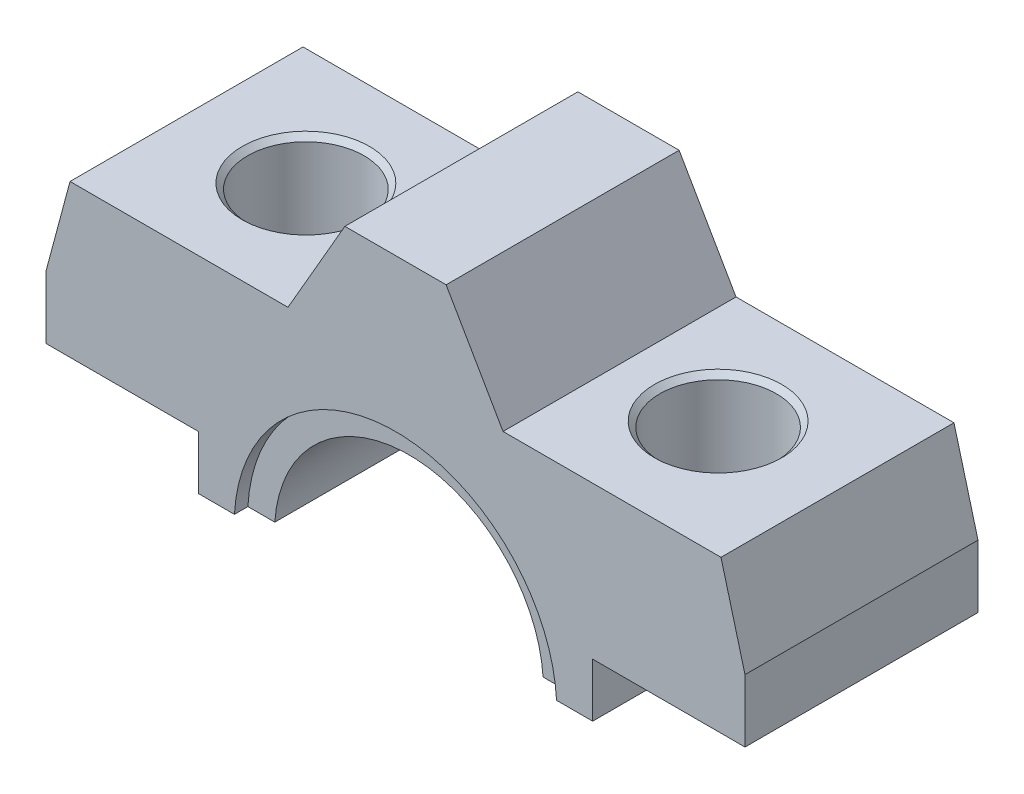
ISO-10303-21;
HEADER;
FILE_DESCRIPTION(('STEP AP214'),'2;1');
FILE_NAME('part.step','',(''),(''),'','','');
FILE_SCHEMA(('AUTOMOTIVE_DESIGN { 1 0 10303 214 1 1 1 1 }'));
ENDSEC;
DATA;
#1=APPLICATION_CONTEXT('core data for automotive mechanical design processes');
#2=APPLICATION_PROTOCOL_DEFINITION('international standard','automotive_design',2000,#1);
#3=PRODUCT_CONTEXT('',#1,'mechanical');
#4=PRODUCT('Part','Part','',(#3));
#5=PRODUCT_RELATED_PRODUCT_CATEGORY('part','',(#4));
#6=PRODUCT_DEFINITION_FORMATION('','',#4);
#7=PRODUCT_DEFINITION_CONTEXT('part definition',#1,'design');
#8=PRODUCT_DEFINITION('design','',#6,#7);
#9=PRODUCT_DEFINITION_SHAPE('','',#8);
#10=(LENGTH_UNIT() NAMED_UNIT(*) SI_UNIT(.MILLI.,.METRE.));
#11=(NAMED_UNIT(*) PLANE_ANGLE_UNIT() SI_UNIT($,.RADIAN.));
#12=(NAMED_UNIT(*) SI_UNIT($,.STERADIAN.) SOLID_ANGLE_UNIT());
#13=UNCERTAINTY_MEASURE_WITH_UNIT(LENGTH_MEASURE(1.E-05),#10,'distance_accuracy_value','');
#14=(GEOMETRIC_REPRESENTATION_CONTEXT(3) GLOBAL_UNCERTAINTY_ASSIGNED_CONTEXT((#13)) GLOBAL_UNIT_ASSIGNED_CONTEXT((#10,
#11,#12)) REPRESENTATION_CONTEXT('',''));
#15=CARTESIAN_POINT('',(0.,0.,0.));
#16=DIRECTION('',(0.,0.,1.));
#17=DIRECTION('',(1.,0.,0.));
#18=AXIS2_PLACEMENT_3D('',#15,#16,#17);
#19=CARTESIAN_POINT('',(22.,1.,-26.));
#20=DIRECTION('',(1.,0.,0.));
#21=DIRECTION('',(0.,0.,-1.));
#22=AXIS2_PLACEMENT_3D('',#19,#20,#21);
#23=PLANE('',#22);
#24=DIRECTION('',(0.,1.,0.));
#25=VECTOR('',#24,1.);
#26=CARTESIAN_POINT('',(22.,1.,-19.4226162893326));
#27=LINE('',#26,#25);
#28=CARTESIAN_POINT('',(22.,1.,-19.4226162893326));
#29=VERTEX_POINT('',#28);
#30=CARTESIAN_POINT('',(22.,7.,-19.4226162893326));
#31=VERTEX_POINT('',#30);
#32=EDGE_CURVE('E200',#29,#31,#27,.T.);
#33=ORIENTED_EDGE('',*,*,#32,.F.);
#34=DIRECTION('',(0.,0.,1.));
#35=VECTOR('',#34,1.);
#36=CARTESIAN_POINT('',(22.,1.,-26.));
#37=LINE('',#36,#35);
#38=CARTESIAN_POINT('',(22.,1.,-26.));
#39=VERTEX_POINT('',#38);
#40=EDGE_CURVE('E210',#39,#29,#37,.T.);
#41=ORIENTED_EDGE('',*,*,#40,.F.);
#42=DIRECTION('',(0.,1.,0.));
#43=VECTOR('',#42,1.);
#44=CARTESIAN_POINT('',(22.,1.,-26.));
#45=LINE('',#44,#43);
#46=CARTESIAN_POINT('',(22.,7.,-26.));
#47=VERTEX_POINT('',#46);
#48=EDGE_CURVE('E421',#39,#47,#45,.T.);
#49=ORIENTED_EDGE('',*,*,#48,.T.);
#50=DIRECTION('',(0.,0.,1.));
#51=VECTOR('',#50,1.);
#52=CARTESIAN_POINT('',(22.,7.,-26.));
#53=LINE('',#52,#51);
#54=EDGE_CURVE('E212',#47,#31,#53,.T.);
#55=ORIENTED_EDGE('',*,*,#54,.T.);
#56=EDGE_LOOP('',(#33,#41,#49,#55));
#57=FACE_BOUND('',#56,.T.);
#58=ADVANCED_FACE('F38',(#57),#23,.T.);
#59=CARTESIAN_POINT('',(-22.,7.,-26.));
#60=DIRECTION('',(-1.,0.,0.));
#61=DIRECTION('',(0.,0.,1.));
#62=AXIS2_PLACEMENT_3D('',#59,#60,#61);
#63=PLANE('',#62);
#64=DIRECTION('',(0.,1.,0.));
#65=VECTOR('',#64,1.);
#66=CARTESIAN_POINT('',(-22.,1.,-6.57738371066743));
#67=LINE('',#66,#65);
#68=CARTESIAN_POINT('',(-22.,1.,-6.57738371066743));
#69=VERTEX_POINT('',#68);
#70=CARTESIAN_POINT('',(-22.,7.,-6.57738371066743));
#71=VERTEX_POINT('',#70);
#72=EDGE_CURVE('E61',#69,#71,#67,.T.);
#73=ORIENTED_EDGE('',*,*,#72,.F.);
#74=DIRECTION('',(0.,0.,1.));
#75=VECTOR('',#74,1.);
#76=CARTESIAN_POINT('',(-22.,1.,-26.));
#77=LINE('',#76,#75);
#78=CARTESIAN_POINT('',(-22.,1.,0.));
#79=VERTEX_POINT('',#78);
#80=EDGE_CURVE('E228',#69,#79,#77,.T.);
#81=ORIENTED_EDGE('',*,*,#80,.T.);
#82=DIRECTION('',(0.,-1.,0.));
#83=VECTOR('',#82,1.);
#84=CARTESIAN_POINT('',(-22.,7.,0.));
#85=LINE('',#84,#83);
#86=CARTESIAN_POINT('',(-22.,7.,0.));
#87=VERTEX_POINT('',#86);
#88=EDGE_CURVE('E436',#87,#79,#85,.T.);
#89=ORIENTED_EDGE('',*,*,#88,.F.);
#90=DIRECTION('',(0.,0.,1.));
#91=VECTOR('',#90,1.);
#92=CARTESIAN_POINT('',(-22.,7.,-26.));
#93=LINE('',#92,#91);
#94=EDGE_CURVE('E232',#71,#87,#93,.T.);
#95=ORIENTED_EDGE('',*,*,#94,.F.);
#96=EDGE_LOOP('',(#73,#81,#89,#95));
#97=FACE_BOUND('',#96,.T.);
#98=ADVANCED_FACE('F265',(#97),#63,.T.);
#99=CARTESIAN_POINT('',(0.,0.,-26.));
#100=DIRECTION('',(0.,0.,1.));
#101=DIRECTION('',(1.,0.,0.));
#102=AXIS2_PLACEMENT_3D('',#99,#100,#101);
#103=CYLINDRICAL_SURFACE('',#102,15.);
#104=CARTESIAN_POINT('',(0.,0.,-24.5));
#105=DIRECTION('',(0.,0.,-1.));
#106=DIRECTION('',(-1.,0.,0.));
#107=AXIS2_PLACEMENT_3D('',#104,#105,#106);
#108=CIRCLE('',#107,15.);
#109=CARTESIAN_POINT('',(14.9666295470958,1.,-24.5));
#110=VERTEX_POINT('',#109);
#111=CARTESIAN_POINT('',(-14.9666295470958,1.,-24.5));
#112=VERTEX_POINT('',#111);
#113=EDGE_CURVE('E387',#110,#112,#108,.F.);
#114=ORIENTED_EDGE('',*,*,#113,.F.);
#115=DIRECTION('',(0.,0.,1.));
#116=VECTOR('',#115,1.);
#117=CARTESIAN_POINT('',(14.9666295470958,1.,-26.));
#118=LINE('',#117,#116);
#119=CARTESIAN_POINT('',(14.9666295470958,1.,-1.5));
#120=VERTEX_POINT('',#119);
#121=EDGE_CURVE('E410',#110,#120,#118,.T.);
#122=ORIENTED_EDGE('',*,*,#121,.T.);
#123=CARTESIAN_POINT('',(0.,0.,-1.5));
#124=DIRECTION('',(0.,0.,1.));
#125=DIRECTION('',(1.,0.,0.));
#126=AXIS2_PLACEMENT_3D('',#123,#124,#125);
#127=CIRCLE('',#126,15.);
#128=CARTESIAN_POINT('',(-14.9666295470958,1.,-1.50000000000001));
#129=VERTEX_POINT('',#128);
#130=EDGE_CURVE('E237',#129,#120,#127,.F.);
#131=ORIENTED_EDGE('',*,*,#130,.F.);
#132=DIRECTION('',(0.,0.,1.));
#133=VECTOR('',#132,1.);
#134=CARTESIAN_POINT('',(-14.9666295470958,1.,-26.));
#135=LINE('',#134,#133);
#136=EDGE_CURVE('E407',#129,#112,#135,.F.);
#137=ORIENTED_EDGE('',*,*,#136,.T.);
#138=EDGE_LOOP('',(#114,#122,#131,#137));
#139=FACE_BOUND('',#138,.T.);
#140=ADVANCED_FACE('F271',(#139),#103,.F.);
#141=CARTESIAN_POINT('',(-22.,1.,-26.));
#142=DIRECTION('',(0.,-1.,0.));
#143=DIRECTION('',(0.,0.,-1.));
#144=AXIS2_PLACEMENT_3D('',#141,#142,#143);
#145=PLANE('',#144);
#146=CARTESIAN_POINT('',(23.,1.,-13.));
#147=DIRECTION('',(0.,1.,0.));
#148=DIRECTION('',(0.,0.,1.));
#149=AXIS2_PLACEMENT_3D('',#146,#147,#148);
#150=CIRCLE('',#149,6.5);
#151=CARTESIAN_POINT('',(22.,1.,-6.57738371066743));
#152=VERTEX_POINT('',#151);
#153=EDGE_CURVE('E197',#29,#152,#150,.T.);
#154=ORIENTED_EDGE('',*,*,#153,.T.);
#155=CARTESIAN_POINT('',(22.,1.,0.));
#156=VERTEX_POINT('',#155);
#157=EDGE_CURVE('E220',#152,#156,#37,.T.);
#158=ORIENTED_EDGE('',*,*,#157,.T.);
#159=DIRECTION('',(1.,0.,0.));
#160=VECTOR('',#159,1.);
#161=CARTESIAN_POINT('',(-22.,1.,0.));
#162=LINE('',#161,#160);
#163=CARTESIAN_POINT('',(17.9722007556114,1.,0.));
#164=VERTEX_POINT('',#163);
#165=EDGE_CURVE('E307',#164,#156,#162,.T.);
#166=ORIENTED_EDGE('',*,*,#165,.F.);
#167=DIRECTION('',(0.,0.,1.));
#168=VECTOR('',#167,1.);
#169=CARTESIAN_POINT('',(17.9722007556114,1.,-1.5));
#170=LINE('',#169,#168);
#171=CARTESIAN_POINT('',(17.9722007556114,1.,-1.5));
#172=VERTEX_POINT('',#171);
#173=EDGE_CURVE('E405',#172,#164,#170,.T.);
#174=ORIENTED_EDGE('',*,*,#173,.F.);
#175=DIRECTION('',(-1.,0.,0.));
#176=VECTOR('',#175,1.);
#177=CARTESIAN_POINT('',(-22.,1.,-1.5));
#178=LINE('',#177,#176);
#179=EDGE_CURVE('E400',#172,#120,#178,.T.);
#180=ORIENTED_EDGE('',*,*,#179,.T.);
#181=ORIENTED_EDGE('',*,*,#121,.F.);
#182=DIRECTION('',(1.,0.,0.));
#183=VECTOR('',#182,1.);
#184=CARTESIAN_POINT('',(-22.,1.,-24.5));
#185=LINE('',#184,#183);
#186=CARTESIAN_POINT('',(17.9722007556114,1.,-24.5));
#187=VERTEX_POINT('',#186);
#188=EDGE_CURVE('E389',#110,#187,#185,.T.);
#189=ORIENTED_EDGE('',*,*,#188,.T.);
#190=DIRECTION('',(0.,0.,-1.));
#191=VECTOR('',#190,1.);
#192=CARTESIAN_POINT('',(17.9722007556114,1.,-24.5));
#193=LINE('',#192,#191);
#194=CARTESIAN_POINT('',(17.9722007556114,1.,-26.));
#195=VERTEX_POINT('',#194);
#196=EDGE_CURVE('E385',#195,#187,#193,.F.);
#197=ORIENTED_EDGE('',*,*,#196,.F.);
#198=DIRECTION('',(1.,0.,0.));
#199=VECTOR('',#198,1.);
#200=CARTESIAN_POINT('',(-22.,1.,-26.));
#201=LINE('',#200,#199);
#202=EDGE_CURVE('E218',#195,#39,#201,.T.);
#203=ORIENTED_EDGE('',*,*,#202,.T.);
#204=ORIENTED_EDGE('',*,*,#40,.T.);
#205=EDGE_LOOP('',(#154,#158,#166,#174,#180,#181,#189,#197,#203,#204));
#206=FACE_BOUND('',#205,.T.);
#207=ADVANCED_FACE('F215',(#206),#145,.T.);
#208=CARTESIAN_POINT('',(-35.0998575495685,24.,-26.));
#209=DIRECTION('',(0.,1.,0.));
#210=DIRECTION('',(0.,0.,1.));
#211=AXIS2_PLACEMENT_3D('',#208,#209,#210);
#212=PLANE('',#211);
#213=CARTESIAN_POINT('',(-23.,24.,-13.));
#214=DIRECTION('',(0.,1.,0.));
#215=DIRECTION('',(0.,0.,1.));
#216=AXIS2_PLACEMENT_3D('',#213,#214,#215);
#217=CIRCLE('',#216,7.09999999999998);
#218=CARTESIAN_POINT('',(-23.,24.,-5.90000000000002));
#219=VERTEX_POINT('',#218);
#220=EDGE_CURVE('E11',#219,#219,#217,.F.);
#221=ORIENTED_EDGE('',*,*,#220,.T.);
#222=EDGE_LOOP('',(#221));
#223=FACE_BOUND('',#222,.T.);
#224=DIRECTION('',(-1.,0.,0.));
#225=VECTOR('',#224,1.);
#226=CARTESIAN_POINT('',(-35.0998575495685,24.,-26.));
#227=LINE('',#226,#225);
#228=CARTESIAN_POINT('',(-12.,24.,-26.));
#229=VERTEX_POINT('',#228);
#230=CARTESIAN_POINT('',(-36.3205080756888,24.,-26.));
#231=VERTEX_POINT('',#230);
#232=EDGE_CURVE('E236',#229,#231,#227,.T.);
#233=ORIENTED_EDGE('',*,*,#232,.T.);
#234=DIRECTION('',(0.,0.,1.));
#235=VECTOR('',#234,1.);
#236=CARTESIAN_POINT('',(-36.3205080756888,24.,-50.0416305603426));
#237=LINE('',#236,#235);
#238=CARTESIAN_POINT('',(-36.3205080756888,24.,0.));
#239=VERTEX_POINT('',#238);
#240=EDGE_CURVE('E367',#231,#239,#237,.T.);
#241=ORIENTED_EDGE('',*,*,#240,.T.);
#242=DIRECTION('',(-1.,0.,0.));
#243=VECTOR('',#242,1.);
#244=CARTESIAN_POINT('',(-35.0998575495685,24.,0.));
#245=LINE('',#244,#243);
#246=CARTESIAN_POINT('',(-12.,24.,0.));
#247=VERTEX_POINT('',#246);
#248=EDGE_CURVE('E324',#247,#239,#245,.T.);
#249=ORIENTED_EDGE('',*,*,#248,.F.);
#250=DIRECTION('',(0.,0.,1.));
#251=VECTOR('',#250,1.);
#252=CARTESIAN_POINT('',(-12.,24.,-26.));
#253=LINE('',#252,#251);
#254=EDGE_CURVE('E241',#229,#247,#253,.T.);
#255=ORIENTED_EDGE('',*,*,#254,.F.);
#256=EDGE_LOOP('',(#233,#241,#249,#255));
#257=FACE_BOUND('',#256,.T.);
#258=ADVANCED_FACE('F498',(#223,#257),#212,.T.);
#259=CARTESIAN_POINT('',(-12.,24.,-26.));
#260=DIRECTION('',(-0.866025403784442,0.499999999999995,0.));
#261=DIRECTION('',(-0.499999999999995,-0.866025403784442,0.));
#262=AXIS2_PLACEMENT_3D('',#259,#260,#261);
#263=PLANE('',#262);
#264=DIRECTION('',(-0.499999999999995,-0.866025403784442,0.));
#265=VECTOR('',#264,1.);
#266=CARTESIAN_POINT('',(-12.,24.,0.));
#267=LINE('',#266,#265);
#268=CARTESIAN_POINT('',(-5.6491470389142,35.,0.));
#269=VERTEX_POINT('',#268);
#270=EDGE_CURVE('E321',#269,#247,#267,.T.);
#271=ORIENTED_EDGE('',*,*,#270,.F.);
#272=DIRECTION('',(0.,0.,1.));
#273=VECTOR('',#272,1.);
#274=CARTESIAN_POINT('',(-5.6491470389142,35.,-26.));
#275=LINE('',#274,#273);
#276=CARTESIAN_POINT('',(-5.6491470389142,35.,-26.));
#277=VERTEX_POINT('',#276);
#278=EDGE_CURVE('E328',#277,#269,#275,.T.);
#279=ORIENTED_EDGE('',*,*,#278,.F.);
#280=DIRECTION('',(-0.499999999999995,-0.866025403784442,0.));
#281=VECTOR('',#280,1.);
#282=CARTESIAN_POINT('',(-12.,24.,-26.));
#283=LINE('',#282,#281);
#284=EDGE_CURVE('E431',#277,#229,#283,.T.);
#285=ORIENTED_EDGE('',*,*,#284,.T.);
#286=ORIENTED_EDGE('',*,*,#254,.T.);
#287=EDGE_LOOP('',(#271,#279,#285,#286));
#288=FACE_BOUND('',#287,.T.);
#289=ADVANCED_FACE('F501',(#288),#263,.T.);
#290=CARTESIAN_POINT('',(-5.6491470389142,35.,-26.));
#291=DIRECTION('',(0.,1.,0.));
#292=DIRECTION('',(0.,0.,1.));
#293=AXIS2_PLACEMENT_3D('',#290,#291,#292);
#294=PLANE('',#293);
#295=DIRECTION('',(-1.,0.,0.));
#296=VECTOR('',#295,1.);
#297=CARTESIAN_POINT('',(-5.6491470389142,35.,0.));
#298=LINE('',#297,#296);
#299=CARTESIAN_POINT('',(5.6491470389142,35.,0.));
#300=VERTEX_POINT('',#299);
#301=EDGE_CURVE('E318',#300,#269,#298,.T.);
#302=ORIENTED_EDGE('',*,*,#301,.F.);
#303=DIRECTION('',(0.,0.,1.));
#304=VECTOR('',#303,1.);
#305=CARTESIAN_POINT('',(5.6491470389142,35.,-26.));
#306=LINE('',#305,#304);
#307=CARTESIAN_POINT('',(5.6491470389142,35.,-26.));
#308=VERTEX_POINT('',#307);
#309=EDGE_CURVE('E330',#308,#300,#306,.T.);
#310=ORIENTED_EDGE('',*,*,#309,.F.);
#311=DIRECTION('',(-1.,0.,0.));
#312=VECTOR('',#311,1.);
#313=CARTESIAN_POINT('',(-5.6491470389142,35.,-26.));
#314=LINE('',#313,#312);
#315=EDGE_CURVE('E428',#308,#277,#314,.T.);
#316=ORIENTED_EDGE('',*,*,#315,.T.);
#317=ORIENTED_EDGE('',*,*,#278,.T.);
#318=EDGE_LOOP('',(#302,#310,#316,#317));
#319=FACE_BOUND('',#318,.T.);
#320=ADVANCED_FACE('F503',(#319),#294,.T.);
#321=CARTESIAN_POINT('',(5.6491470389142,35.,-26.));
#322=DIRECTION('',(0.866025403784442,0.499999999999995,0.));
#323=DIRECTION('',(-0.499999999999995,0.866025403784442,0.));
#324=AXIS2_PLACEMENT_3D('',#321,#322,#323);
#325=PLANE('',#324);
#326=DIRECTION('',(-0.499999999999995,0.866025403784442,0.));
#327=VECTOR('',#326,1.);
#328=CARTESIAN_POINT('',(5.6491470389142,35.,0.));
#329=LINE('',#328,#327);
#330=CARTESIAN_POINT('',(12.,24.,0.));
#331=VERTEX_POINT('',#330);
#332=EDGE_CURVE('E315',#331,#300,#329,.T.);
#333=ORIENTED_EDGE('',*,*,#332,.F.);
#334=DIRECTION('',(0.,0.,1.));
#335=VECTOR('',#334,1.);
#336=CARTESIAN_POINT('',(12.,24.,-26.));
#337=LINE('',#336,#335);
#338=CARTESIAN_POINT('',(12.,24.,-26.));
#339=VERTEX_POINT('',#338);
#340=EDGE_CURVE('E332',#339,#331,#337,.T.);
#341=ORIENTED_EDGE('',*,*,#340,.F.);
#342=DIRECTION('',(-0.499999999999995,0.866025403784442,0.));
#343=VECTOR('',#342,1.);
#344=CARTESIAN_POINT('',(5.6491470389142,35.,-26.));
#345=LINE('',#344,#343);
#346=EDGE_CURVE('E426',#339,#308,#345,.T.);
#347=ORIENTED_EDGE('',*,*,#346,.T.);
#348=ORIENTED_EDGE('',*,*,#309,.T.);
#349=EDGE_LOOP('',(#333,#341,#347,#348));
#350=FACE_BOUND('',#349,.T.);
#351=ADVANCED_FACE('F343',(#350),#325,.T.);
#352=CARTESIAN_POINT('',(12.,24.,-26.));
#353=DIRECTION('',(0.,1.,0.));
#354=DIRECTION('',(0.,0.,1.));
#355=AXIS2_PLACEMENT_3D('',#352,#353,#354);
#356=PLANE('',#355);
#357=CARTESIAN_POINT('',(23.,24.,-13.));
#358=DIRECTION('',(0.,1.,0.));
#359=DIRECTION('',(0.,0.,1.));
#360=AXIS2_PLACEMENT_3D('',#357,#358,#359);
#361=CIRCLE('',#360,7.09999999999998);
#362=CARTESIAN_POINT('',(23.,24.,-5.90000000000002));
#363=VERTEX_POINT('',#362);
#364=EDGE_CURVE('E249',#363,#363,#361,.F.);
#365=ORIENTED_EDGE('',*,*,#364,.T.);
#366=EDGE_LOOP('',(#365));
#367=FACE_BOUND('',#366,.T.);
#368=ORIENTED_EDGE('',*,*,#340,.T.);
#369=DIRECTION('',(-1.,0.,0.));
#370=VECTOR('',#369,1.);
#371=CARTESIAN_POINT('',(12.,24.,0.));
#372=LINE('',#371,#370);
#373=CARTESIAN_POINT('',(36.3205080756888,24.,0.));
#374=VERTEX_POINT('',#373);
#375=EDGE_CURVE('E300',#374,#331,#372,.T.);
#376=ORIENTED_EDGE('',*,*,#375,.F.);
#377=DIRECTION('',(0.,0.,1.));
#378=VECTOR('',#377,1.);
#379=CARTESIAN_POINT('',(36.3205080756888,24.,-50.0416305603426));
#380=LINE('',#379,#378);
#381=CARTESIAN_POINT('',(36.3205080756888,24.,-26.));
#382=VERTEX_POINT('',#381);
#383=EDGE_CURVE('E353',#382,#374,#380,.T.);
#384=ORIENTED_EDGE('',*,*,#383,.F.);
#385=DIRECTION('',(-1.,0.,0.));
#386=VECTOR('',#385,1.);
#387=CARTESIAN_POINT('',(12.,24.,-26.));
#388=LINE('',#387,#386);
#389=EDGE_CURVE('E339',#382,#339,#388,.T.);
#390=ORIENTED_EDGE('',*,*,#389,.T.);
#391=EDGE_LOOP('',(#368,#376,#384,#390));
#392=FACE_BOUND('',#391,.T.);
#393=ADVANCED_FACE('F286',(#367,#392),#356,.T.);
#394=CARTESIAN_POINT('',(22.,7.,-26.));
#395=DIRECTION('',(0.,-1.,0.));
#396=DIRECTION('',(0.,0.,-1.));
#397=AXIS2_PLACEMENT_3D('',#394,#395,#396);
#398=PLANE('',#397);
#399=CARTESIAN_POINT('',(23.,7.,-13.));
#400=DIRECTION('',(0.,-1.,0.));
#401=DIRECTION('',(0.,0.,-1.));
#402=AXIS2_PLACEMENT_3D('',#399,#400,#401);
#403=CIRCLE('',#402,6.5);
#404=CARTESIAN_POINT('',(22.,7.,-6.57738371066744));
#405=VERTEX_POINT('',#404);
#406=EDGE_CURVE('E53',#31,#405,#403,.T.);
#407=ORIENTED_EDGE('',*,*,#406,.F.);
#408=ORIENTED_EDGE('',*,*,#54,.F.);
#409=DIRECTION('',(1.,0.,0.));
#410=VECTOR('',#409,1.);
#411=CARTESIAN_POINT('',(22.,7.,-26.));
#412=LINE('',#411,#410);
#413=CARTESIAN_POINT('',(39.,7.,-26.));
#414=VERTEX_POINT('',#413);
#415=EDGE_CURVE('E423',#47,#414,#412,.T.);
#416=ORIENTED_EDGE('',*,*,#415,.T.);
#417=DIRECTION('',(0.,0.,1.));
#418=VECTOR('',#417,1.);
#419=CARTESIAN_POINT('',(39.,7.,-26.));
#420=LINE('',#419,#418);
#421=CARTESIAN_POINT('',(39.,7.,0.));
#422=VERTEX_POINT('',#421);
#423=EDGE_CURVE('E297',#414,#422,#420,.T.);
#424=ORIENTED_EDGE('',*,*,#423,.T.);
#425=DIRECTION('',(1.,0.,0.));
#426=VECTOR('',#425,1.);
#427=CARTESIAN_POINT('',(22.,7.,0.));
#428=LINE('',#427,#426);
#429=CARTESIAN_POINT('',(22.,7.,0.));
#430=VERTEX_POINT('',#429);
#431=EDGE_CURVE('E293',#430,#422,#428,.T.);
#432=ORIENTED_EDGE('',*,*,#431,.F.);
#433=EDGE_CURVE('E219',#405,#430,#53,.T.);
#434=ORIENTED_EDGE('',*,*,#433,.F.);
#435=EDGE_LOOP('',(#407,#408,#416,#424,#432,#434));
#436=FACE_BOUND('',#435,.T.);
#437=ADVANCED_FACE('F279',(#436),#398,.T.);
#438=DIRECTION('',(0.,1.,0.));
#439=VECTOR('',#438,1.);
#440=CARTESIAN_POINT('',(22.,1.,-6.57738371066743));
#441=LINE('',#440,#439);
#442=EDGE_CURVE('E201',#405,#152,#441,.F.);
#443=ORIENTED_EDGE('',*,*,#442,.F.);
#444=ORIENTED_EDGE('',*,*,#433,.T.);
#445=DIRECTION('',(0.,1.,0.));
#446=VECTOR('',#445,1.);
#447=CARTESIAN_POINT('',(22.,1.,0.));
#448=LINE('',#447,#446);
#449=EDGE_CURVE('E301',#156,#430,#448,.T.);
#450=ORIENTED_EDGE('',*,*,#449,.F.);
#451=ORIENTED_EDGE('',*,*,#157,.F.);
#452=EDGE_LOOP('',(#443,#444,#450,#451));
#453=FACE_BOUND('',#452,.T.);
#454=ADVANCED_FACE('F267',(#453),#23,.T.);
#455=CARTESIAN_POINT('',(-23.,1.,-13.));
#456=DIRECTION('',(0.,1.,0.));
#457=DIRECTION('',(0.,0.,1.));
#458=AXIS2_PLACEMENT_3D('',#455,#456,#457);
#459=CIRCLE('',#458,6.5);
#460=CARTESIAN_POINT('',(-22.,1.,-19.4226162893326));
#461=VERTEX_POINT('',#460);
#462=EDGE_CURVE('E476',#69,#461,#459,.T.);
#463=ORIENTED_EDGE('',*,*,#462,.T.);
#464=CARTESIAN_POINT('',(-22.,1.,-26.));
#465=VERTEX_POINT('',#464);
#466=EDGE_CURVE('E223',#465,#461,#77,.T.);
#467=ORIENTED_EDGE('',*,*,#466,.F.);
#468=CARTESIAN_POINT('',(-17.9722007556114,1.,-26.));
#469=VERTEX_POINT('',#468);
#470=EDGE_CURVE('E418',#465,#469,#201,.T.);
#471=ORIENTED_EDGE('',*,*,#470,.T.);
#472=DIRECTION('',(0.,0.,-1.));
#473=VECTOR('',#472,1.);
#474=CARTESIAN_POINT('',(-17.9722007556114,1.,-24.5));
#475=LINE('',#474,#473);
#476=CARTESIAN_POINT('',(-17.9722007556114,1.,-24.5));
#477=VERTEX_POINT('',#476);
#478=EDGE_CURVE('E382',#477,#469,#475,.T.);
#479=ORIENTED_EDGE('',*,*,#478,.F.);
#480=DIRECTION('',(1.,0.,0.));
#481=VECTOR('',#480,1.);
#482=CARTESIAN_POINT('',(-22.,1.,-24.5));
#483=LINE('',#482,#481);
#484=EDGE_CURVE('E240',#477,#112,#483,.T.);
#485=ORIENTED_EDGE('',*,*,#484,.T.);
#486=ORIENTED_EDGE('',*,*,#136,.F.);
#487=DIRECTION('',(-1.,0.,0.));
#488=VECTOR('',#487,1.);
#489=CARTESIAN_POINT('',(-22.,1.,-1.5));
#490=LINE('',#489,#488);
#491=CARTESIAN_POINT('',(-17.9722007556114,1.,-1.5));
#492=VERTEX_POINT('',#491);
#493=EDGE_CURVE('E396',#129,#492,#490,.T.);
#494=ORIENTED_EDGE('',*,*,#493,.T.);
#495=DIRECTION('',(0.,0.,1.));
#496=VECTOR('',#495,1.);
#497=CARTESIAN_POINT('',(-17.9722007556114,1.,-1.5));
#498=LINE('',#497,#496);
#499=CARTESIAN_POINT('',(-17.9722007556114,1.,0.));
#500=VERTEX_POINT('',#499);
#501=EDGE_CURVE('E403',#500,#492,#498,.F.);
#502=ORIENTED_EDGE('',*,*,#501,.F.);
#503=EDGE_CURVE('E308',#79,#500,#162,.T.);
#504=ORIENTED_EDGE('',*,*,#503,.F.);
#505=ORIENTED_EDGE('',*,*,#80,.F.);
#506=EDGE_LOOP('',(#463,#467,#471,#479,#485,#486,#494,#502,#504,#505));
#507=FACE_BOUND('',#506,.T.);
#508=ADVANCED_FACE('F278',(#507),#145,.T.);
#509=DIRECTION('',(0.,1.,0.));
#510=VECTOR('',#509,1.);
#511=CARTESIAN_POINT('',(-22.,1.,-19.4226162893326));
#512=LINE('',#511,#510);
#513=CARTESIAN_POINT('',(-22.,7.,-19.4226162893326));
#514=VERTEX_POINT('',#513);
#515=EDGE_CURVE('E474',#514,#461,#512,.F.);
#516=ORIENTED_EDGE('',*,*,#515,.F.);
#517=CARTESIAN_POINT('',(-22.,7.,-26.));
#518=VERTEX_POINT('',#517);
#519=EDGE_CURVE('E229',#518,#514,#93,.T.);
#520=ORIENTED_EDGE('',*,*,#519,.F.);
#521=DIRECTION('',(0.,-1.,0.));
#522=VECTOR('',#521,1.);
#523=CARTESIAN_POINT('',(-22.,7.,-26.));
#524=LINE('',#523,#522);
#525=EDGE_CURVE('E415',#518,#465,#524,.T.);
#526=ORIENTED_EDGE('',*,*,#525,.T.);
#527=ORIENTED_EDGE('',*,*,#466,.T.);
#528=EDGE_LOOP('',(#516,#520,#526,#527));
#529=FACE_BOUND('',#528,.T.);
#530=ADVANCED_FACE('F274',(#529),#63,.T.);
#531=CARTESIAN_POINT('',(-39.,7.,-26.));
#532=DIRECTION('',(0.,-1.,0.));
#533=DIRECTION('',(0.,0.,-1.));
#534=AXIS2_PLACEMENT_3D('',#531,#532,#533);
#535=PLANE('',#534);
#536=CARTESIAN_POINT('',(-23.,7.,-13.));
#537=DIRECTION('',(0.,-1.,0.));
#538=DIRECTION('',(0.,0.,-1.));
#539=AXIS2_PLACEMENT_3D('',#536,#537,#538);
#540=CIRCLE('',#539,6.5);
#541=EDGE_CURVE('E244',#71,#514,#540,.T.);
#542=ORIENTED_EDGE('',*,*,#541,.F.);
#543=ORIENTED_EDGE('',*,*,#94,.T.);
#544=DIRECTION('',(1.,0.,0.));
#545=VECTOR('',#544,1.);
#546=CARTESIAN_POINT('',(-39.,7.,0.));
#547=LINE('',#546,#545);
#548=CARTESIAN_POINT('',(-39.,7.,0.));
#549=VERTEX_POINT('',#548);
#550=EDGE_CURVE('E412',#549,#87,#547,.T.);
#551=ORIENTED_EDGE('',*,*,#550,.F.);
#552=DIRECTION('',(0.,0.,1.));
#553=VECTOR('',#552,1.);
#554=CARTESIAN_POINT('',(-39.,7.,-26.));
#555=LINE('',#554,#553);
#556=CARTESIAN_POINT('',(-39.,7.,-26.));
#557=VERTEX_POINT('',#556);
#558=EDGE_CURVE('E233',#557,#549,#555,.T.);
#559=ORIENTED_EDGE('',*,*,#558,.F.);
#560=DIRECTION('',(1.,0.,0.));
#561=VECTOR('',#560,1.);
#562=CARTESIAN_POINT('',(-39.,7.,-26.));
#563=LINE('',#562,#561);
#564=EDGE_CURVE('E326',#557,#518,#563,.T.);
#565=ORIENTED_EDGE('',*,*,#564,.T.);
#566=ORIENTED_EDGE('',*,*,#519,.T.);
#567=EDGE_LOOP('',(#542,#543,#551,#559,#565,#566));
#568=FACE_BOUND('',#567,.T.);
#569=ADVANCED_FACE('F483',(#568),#535,.T.);
#570=CARTESIAN_POINT('',(0.,7.,-26.));
#571=DIRECTION('',(0.,0.,1.));
#572=DIRECTION('',(1.,0.,0.));
#573=AXIS2_PLACEMENT_3D('',#570,#571,#572);
#574=PLANE('',#573);
#575=ORIENTED_EDGE('',*,*,#346,.F.);
#576=ORIENTED_EDGE('',*,*,#389,.F.);
#577=DIRECTION('',(0.258819045102522,-0.965925826289068,0.));
#578=VECTOR('',#577,1.);
#579=CARTESIAN_POINT('',(39.,14.,-26.));
#580=LINE('',#579,#578);
#581=CARTESIAN_POINT('',(39.,14.,-26.));
#582=VERTEX_POINT('',#581);
#583=EDGE_CURVE('E358',#382,#582,#580,.T.);
#584=ORIENTED_EDGE('',*,*,#583,.T.);
#585=DIRECTION('',(0.,-1.,0.));
#586=VECTOR('',#585,1.);
#587=CARTESIAN_POINT('',(39.,7.,-26.));
#588=LINE('',#587,#586);
#589=EDGE_CURVE('E360',#582,#414,#588,.T.);
#590=ORIENTED_EDGE('',*,*,#589,.T.);
#591=ORIENTED_EDGE('',*,*,#415,.F.);
#592=ORIENTED_EDGE('',*,*,#48,.F.);
#593=ORIENTED_EDGE('',*,*,#202,.F.);
#594=CARTESIAN_POINT('',(0.,0.,-26.));
#595=DIRECTION('',(0.,0.,-1.));
#596=DIRECTION('',(-1.,0.,0.));
#597=AXIS2_PLACEMENT_3D('',#594,#595,#596);
#598=CIRCLE('',#597,18.);
#599=EDGE_CURVE('E378',#469,#195,#598,.T.);
#600=ORIENTED_EDGE('',*,*,#599,.F.);
#601=ORIENTED_EDGE('',*,*,#470,.F.);
#602=ORIENTED_EDGE('',*,*,#525,.F.);
#603=ORIENTED_EDGE('',*,*,#564,.F.);
#604=DIRECTION('',(0.,1.,0.));
#605=VECTOR('',#604,1.);
#606=CARTESIAN_POINT('',(-39.,7.,-26.));
#607=LINE('',#606,#605);
#608=CARTESIAN_POINT('',(-39.,14.,-26.));
#609=VERTEX_POINT('',#608);
#610=EDGE_CURVE('E366',#557,#609,#607,.T.);
#611=ORIENTED_EDGE('',*,*,#610,.T.);
#612=DIRECTION('',(0.258819045102522,0.965925826289068,0.));
#613=VECTOR('',#612,1.);
#614=CARTESIAN_POINT('',(-39.,14.,-26.));
#615=LINE('',#614,#613);
#616=EDGE_CURVE('E363',#609,#231,#615,.T.);
#617=ORIENTED_EDGE('',*,*,#616,.T.);
#618=ORIENTED_EDGE('',*,*,#232,.F.);
#619=ORIENTED_EDGE('',*,*,#284,.F.);
#620=ORIENTED_EDGE('',*,*,#315,.F.);
#621=EDGE_LOOP('',(#575,#576,#584,#590,#591,#592,#593,#600,#601,#602,#603,#611,#617,#618,#619,#620));
#622=FACE_BOUND('',#621,.T.);
#623=ADVANCED_FACE('F464',(#622),#574,.F.);
#624=CARTESIAN_POINT('',(0.,7.,0.));
#625=DIRECTION('',(0.,0.,1.));
#626=DIRECTION('',(1.,0.,0.));
#627=AXIS2_PLACEMENT_3D('',#624,#625,#626);
#628=PLANE('',#627);
#629=ORIENTED_EDGE('',*,*,#449,.T.);
#630=ORIENTED_EDGE('',*,*,#431,.T.);
#631=DIRECTION('',(0.,1.,0.));
#632=VECTOR('',#631,1.);
#633=CARTESIAN_POINT('',(39.,7.,0.));
#634=LINE('',#633,#632);
#635=CARTESIAN_POINT('',(39.,14.,0.));
#636=VERTEX_POINT('',#635);
#637=EDGE_CURVE('E348',#422,#636,#634,.T.);
#638=ORIENTED_EDGE('',*,*,#637,.T.);
#639=DIRECTION('',(-0.258819045102522,0.965925826289068,0.));
#640=VECTOR('',#639,1.);
#641=CARTESIAN_POINT('',(39.,14.,0.));
#642=LINE('',#641,#640);
#643=EDGE_CURVE('E347',#636,#374,#642,.T.);
#644=ORIENTED_EDGE('',*,*,#643,.T.);
#645=ORIENTED_EDGE('',*,*,#375,.T.);
#646=ORIENTED_EDGE('',*,*,#332,.T.);
#647=ORIENTED_EDGE('',*,*,#301,.T.);
#648=ORIENTED_EDGE('',*,*,#270,.T.);
#649=ORIENTED_EDGE('',*,*,#248,.T.);
#650=DIRECTION('',(-0.258819045102522,-0.965925826289068,0.));
#651=VECTOR('',#650,1.);
#652=CARTESIAN_POINT('',(-39.,14.,0.));
#653=LINE('',#652,#651);
#654=CARTESIAN_POINT('',(-39.,14.,0.));
#655=VERTEX_POINT('',#654);
#656=EDGE_CURVE('E362',#239,#655,#653,.T.);
#657=ORIENTED_EDGE('',*,*,#656,.T.);
#658=DIRECTION('',(0.,-1.,0.));
#659=VECTOR('',#658,1.);
#660=CARTESIAN_POINT('',(-39.,7.,0.));
#661=LINE('',#660,#659);
#662=EDGE_CURVE('E370',#655,#549,#661,.T.);
#663=ORIENTED_EDGE('',*,*,#662,.T.);
#664=ORIENTED_EDGE('',*,*,#550,.T.);
#665=ORIENTED_EDGE('',*,*,#88,.T.);
#666=ORIENTED_EDGE('',*,*,#503,.T.);
#667=CARTESIAN_POINT('',(0.,0.,0.));
#668=DIRECTION('',(0.,0.,1.));
#669=DIRECTION('',(1.,0.,0.));
#670=AXIS2_PLACEMENT_3D('',#667,#668,#669);
#671=CIRCLE('',#670,18.);
#672=EDGE_CURVE('E392',#164,#500,#671,.T.);
#673=ORIENTED_EDGE('',*,*,#672,.F.);
#674=ORIENTED_EDGE('',*,*,#165,.T.);
#675=EDGE_LOOP('',(#629,#630,#638,#644,#645,#646,#647,#648,#649,#657,#663,#664,#665,#666,#673,#674));
#676=FACE_BOUND('',#675,.T.);
#677=ADVANCED_FACE('F304',(#676),#628,.T.);
#678=CARTESIAN_POINT('',(0.,0.,-1.5));
#679=DIRECTION('',(0.,0.,1.));
#680=DIRECTION('',(1.,0.,0.));
#681=AXIS2_PLACEMENT_3D('',#678,#679,#680);
#682=CYLINDRICAL_SURFACE('',#681,18.);
#683=ORIENTED_EDGE('',*,*,#173,.T.);
#684=ORIENTED_EDGE('',*,*,#672,.T.);
#685=ORIENTED_EDGE('',*,*,#501,.T.);
#686=CARTESIAN_POINT('',(0.,0.,-1.5));
#687=DIRECTION('',(0.,0.,1.));
#688=DIRECTION('',(1.,0.,0.));
#689=AXIS2_PLACEMENT_3D('',#686,#687,#688);
#690=CIRCLE('',#689,18.);
#691=EDGE_CURVE('E393',#172,#492,#690,.T.);
#692=ORIENTED_EDGE('',*,*,#691,.F.);
#693=EDGE_LOOP('',(#683,#684,#685,#692));
#694=FACE_BOUND('',#693,.T.);
#695=ADVANCED_FACE('F447',(#694),#682,.F.);
#696=CARTESIAN_POINT('',(0.,0.,-1.5));
#697=DIRECTION('',(0.,0.,1.));
#698=DIRECTION('',(1.,0.,0.));
#699=AXIS2_PLACEMENT_3D('',#696,#697,#698);
#700=PLANE('',#699);
#701=ORIENTED_EDGE('',*,*,#691,.T.);
#702=ORIENTED_EDGE('',*,*,#493,.F.);
#703=ORIENTED_EDGE('',*,*,#130,.T.);
#704=ORIENTED_EDGE('',*,*,#179,.F.);
#705=EDGE_LOOP('',(#701,#702,#703,#704));
#706=FACE_BOUND('',#705,.T.);
#707=ADVANCED_FACE('F450',(#706),#700,.T.);
#708=CARTESIAN_POINT('',(0.,0.,-24.5));
#709=DIRECTION('',(0.,0.,-1.));
#710=DIRECTION('',(-1.,0.,0.));
#711=AXIS2_PLACEMENT_3D('',#708,#709,#710);
#712=CYLINDRICAL_SURFACE('',#711,18.);
#713=ORIENTED_EDGE('',*,*,#196,.T.);
#714=CARTESIAN_POINT('',(0.,0.,-24.5));
#715=DIRECTION('',(0.,0.,-1.));
#716=DIRECTION('',(-1.,0.,0.));
#717=AXIS2_PLACEMENT_3D('',#714,#715,#716);
#718=CIRCLE('',#717,18.);
#719=EDGE_CURVE('E379',#477,#187,#718,.T.);
#720=ORIENTED_EDGE('',*,*,#719,.F.);
#721=ORIENTED_EDGE('',*,*,#478,.T.);
#722=ORIENTED_EDGE('',*,*,#599,.T.);
#723=EDGE_LOOP('',(#713,#720,#721,#722));
#724=FACE_BOUND('',#723,.T.);
#725=ADVANCED_FACE('F462',(#724),#712,.F.);
#726=CARTESIAN_POINT('',(0.,0.,-24.5));
#727=DIRECTION('',(0.,0.,-1.));
#728=DIRECTION('',(-1.,0.,0.));
#729=AXIS2_PLACEMENT_3D('',#726,#727,#728);
#730=PLANE('',#729);
#731=ORIENTED_EDGE('',*,*,#113,.T.);
#732=ORIENTED_EDGE('',*,*,#484,.F.);
#733=ORIENTED_EDGE('',*,*,#719,.T.);
#734=ORIENTED_EDGE('',*,*,#188,.F.);
#735=EDGE_LOOP('',(#731,#732,#733,#734));
#736=FACE_BOUND('',#735,.T.);
#737=ADVANCED_FACE('F456',(#736),#730,.T.);
#738=CARTESIAN_POINT('',(-39.,14.,-50.0416305603426));
#739=DIRECTION('',(-0.965925826289068,0.258819045102522,0.));
#740=DIRECTION('',(-0.258819045102522,-0.965925826289068,0.));
#741=AXIS2_PLACEMENT_3D('',#738,#739,#740);
#742=PLANE('',#741);
#743=ORIENTED_EDGE('',*,*,#616,.F.);
#744=DIRECTION('',(0.,0.,1.));
#745=VECTOR('',#744,1.);
#746=CARTESIAN_POINT('',(-39.,14.,-50.0416305603426));
#747=LINE('',#746,#745);
#748=EDGE_CURVE('E373',#609,#655,#747,.T.);
#749=ORIENTED_EDGE('',*,*,#748,.T.);
#750=ORIENTED_EDGE('',*,*,#656,.F.);
#751=ORIENTED_EDGE('',*,*,#240,.F.);
#752=EDGE_LOOP('',(#743,#749,#750,#751));
#753=FACE_BOUND('',#752,.T.);
#754=ADVANCED_FACE('F493',(#753),#742,.T.);
#755=CARTESIAN_POINT('',(-39.,7.,-50.0416305603426));
#756=DIRECTION('',(-1.,0.,0.));
#757=DIRECTION('',(0.,0.,1.));
#758=AXIS2_PLACEMENT_3D('',#755,#756,#757);
#759=PLANE('',#758);
#760=ORIENTED_EDGE('',*,*,#610,.F.);
#761=ORIENTED_EDGE('',*,*,#558,.T.);
#762=ORIENTED_EDGE('',*,*,#662,.F.);
#763=ORIENTED_EDGE('',*,*,#748,.F.);
#764=EDGE_LOOP('',(#760,#761,#762,#763));
#765=FACE_BOUND('',#764,.T.);
#766=ADVANCED_FACE('F486',(#765),#759,.T.);
#767=CARTESIAN_POINT('',(39.,14.,-50.0416305603426));
#768=DIRECTION('',(0.965925826289068,0.258819045102522,0.));
#769=DIRECTION('',(-0.258819045102522,0.965925826289068,0.));
#770=AXIS2_PLACEMENT_3D('',#767,#768,#769);
#771=PLANE('',#770);
#772=ORIENTED_EDGE('',*,*,#583,.F.);
#773=ORIENTED_EDGE('',*,*,#383,.T.);
#774=ORIENTED_EDGE('',*,*,#643,.F.);
#775=DIRECTION('',(0.,0.,1.));
#776=VECTOR('',#775,1.);
#777=CARTESIAN_POINT('',(39.,14.,-50.0416305603426));
#778=LINE('',#777,#776);
#779=EDGE_CURVE('E351',#582,#636,#778,.T.);
#780=ORIENTED_EDGE('',*,*,#779,.F.);
#781=EDGE_LOOP('',(#772,#773,#774,#780));
#782=FACE_BOUND('',#781,.T.);
#783=ADVANCED_FACE('F471',(#782),#771,.T.);
#784=CARTESIAN_POINT('',(39.,7.,-50.0416305603426));
#785=DIRECTION('',(1.,0.,0.));
#786=DIRECTION('',(0.,0.,-1.));
#787=AXIS2_PLACEMENT_3D('',#784,#785,#786);
#788=PLANE('',#787);
#789=ORIENTED_EDGE('',*,*,#589,.F.);
#790=ORIENTED_EDGE('',*,*,#779,.T.);
#791=ORIENTED_EDGE('',*,*,#637,.F.);
#792=ORIENTED_EDGE('',*,*,#423,.F.);
#793=EDGE_LOOP('',(#789,#790,#791,#792));
#794=FACE_BOUND('',#793,.T.);
#795=ADVANCED_FACE('F470',(#794),#788,.T.);
#796=CARTESIAN_POINT('',(-23.,1.,-13.));
#797=DIRECTION('',(0.,1.,0.));
#798=DIRECTION('',(0.,0.,1.));
#799=AXIS2_PLACEMENT_3D('',#796,#797,#798);
#800=CYLINDRICAL_SURFACE('',#799,6.5);
#801=CARTESIAN_POINT('',(-23.,23.4,-13.));
#802=DIRECTION('',(0.,1.,0.));
#803=DIRECTION('',(0.,0.,1.));
#804=AXIS2_PLACEMENT_3D('',#801,#802,#803);
#805=CIRCLE('',#804,6.5);
#806=CARTESIAN_POINT('',(-23.,23.4,-6.5));
#807=VERTEX_POINT('',#806);
#808=EDGE_CURVE('E46',#807,#807,#805,.T.);
#809=ORIENTED_EDGE('',*,*,#808,.T.);
#810=EDGE_LOOP('',(#809));
#811=FACE_BOUND('',#810,.T.);
#812=ORIENTED_EDGE('',*,*,#72,.T.);
#813=ORIENTED_EDGE('',*,*,#541,.T.);
#814=ORIENTED_EDGE('',*,*,#515,.T.);
#815=ORIENTED_EDGE('',*,*,#462,.F.);
#816=EDGE_LOOP('',(#812,#813,#814,#815));
#817=FACE_BOUND('',#816,.T.);
#818=ADVANCED_FACE('F254',(#811,#817),#800,.F.);
#819=CARTESIAN_POINT('',(23.,1.,-13.));
#820=DIRECTION('',(0.,1.,0.));
#821=DIRECTION('',(0.,0.,1.));
#822=AXIS2_PLACEMENT_3D('',#819,#820,#821);
#823=CYLINDRICAL_SURFACE('',#822,6.5);
#824=CARTESIAN_POINT('',(23.,23.4,-13.));
#825=DIRECTION('',(0.,1.,0.));
#826=DIRECTION('',(0.,0.,1.));
#827=AXIS2_PLACEMENT_3D('',#824,#825,#826);
#828=CIRCLE('',#827,6.5);
#829=CARTESIAN_POINT('',(23.,23.4,-6.5));
#830=VERTEX_POINT('',#829);
#831=EDGE_CURVE('E213',#830,#830,#828,.T.);
#832=ORIENTED_EDGE('',*,*,#831,.T.);
#833=EDGE_LOOP('',(#832));
#834=FACE_BOUND('',#833,.T.);
#835=ORIENTED_EDGE('',*,*,#32,.T.);
#836=ORIENTED_EDGE('',*,*,#406,.T.);
#837=ORIENTED_EDGE('',*,*,#442,.T.);
#838=ORIENTED_EDGE('',*,*,#153,.F.);
#839=EDGE_LOOP('',(#835,#836,#837,#838));
#840=FACE_BOUND('',#839,.T.);
#841=ADVANCED_FACE('F199',(#834,#840),#823,.F.);
#842=CARTESIAN_POINT('',(23.,23.4,-13.));
#843=DIRECTION('',(0.,1.,0.));
#844=DIRECTION('',(0.,0.,1.));
#845=AXIS2_PLACEMENT_3D('',#842,#843,#844);
#846=CONICAL_SURFACE('',#845,6.5,0.78539816339745);
#847=ORIENTED_EDGE('',*,*,#364,.F.);
#848=EDGE_LOOP('',(#847));
#849=FACE_BOUND('',#848,.T.);
#850=ORIENTED_EDGE('',*,*,#831,.F.);
#851=EDGE_LOOP('',(#850));
#852=FACE_BOUND('',#851,.T.);
#853=ADVANCED_FACE('F257',(#849,#852),#846,.F.);
#854=CARTESIAN_POINT('',(-23.,23.4,-13.));
#855=DIRECTION('',(0.,1.,0.));
#856=DIRECTION('',(0.,0.,1.));
#857=AXIS2_PLACEMENT_3D('',#854,#855,#856);
#858=CONICAL_SURFACE('',#857,6.5,0.78539816339745);
#859=ORIENTED_EDGE('',*,*,#220,.F.);
#860=EDGE_LOOP('',(#859));
#861=FACE_BOUND('',#860,.T.);
#862=ORIENTED_EDGE('',*,*,#808,.F.);
#863=EDGE_LOOP('',(#862));
#864=FACE_BOUND('',#863,.T.);
#865=ADVANCED_FACE('F40',(#861,#864),#858,.F.);
#866=CLOSED_SHELL('',(#58,#98,#140,#207,#258,#289,#320,#351,#393,#437,#454,#508,#530,#569,#623,
#677,#695,#707,#725,#737,#754,#766,#783,#795,#818,#841,#853,#865));
#867=MANIFOLD_SOLID_BREP('B2',#866);
#868=ADVANCED_BREP_SHAPE_REPRESENTATION('',(#18,#867),#14);
#869=SHAPE_DEFINITION_REPRESENTATION(#9,#868);
ENDSEC;
END-ISO-10303-21;
